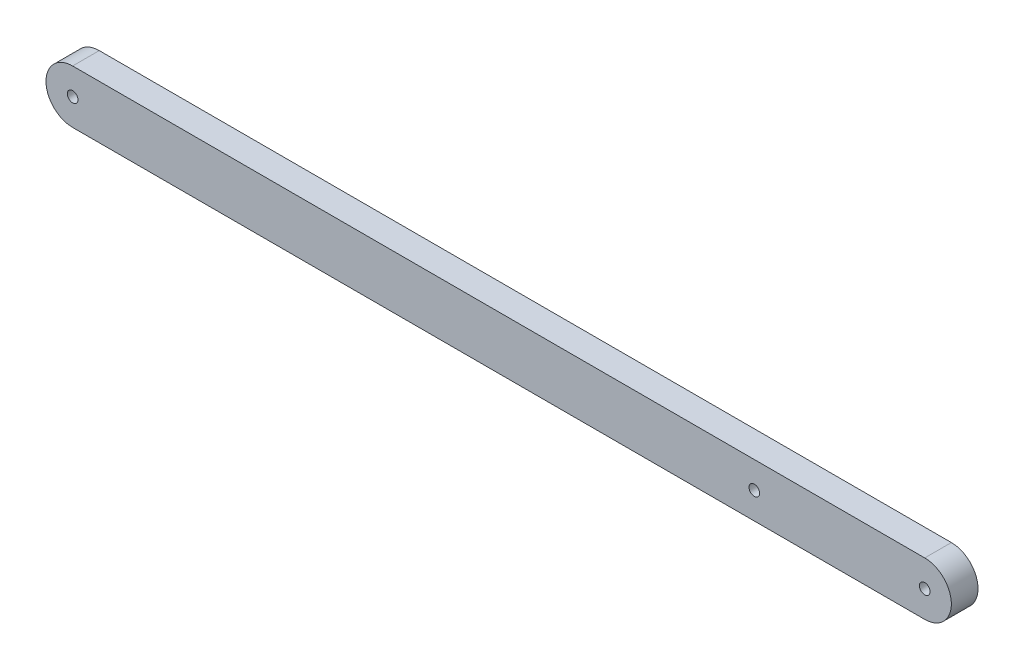
ISO-10303-21;
HEADER;
FILE_DESCRIPTION(('STEP AP214'),'2;1');
FILE_NAME('part.step','',(''),(''),'','','');
FILE_SCHEMA(('AUTOMOTIVE_DESIGN { 1 0 10303 214 1 1 1 1 }'));
ENDSEC;
DATA;
#1=APPLICATION_CONTEXT('core data for automotive mechanical design processes');
#2=APPLICATION_PROTOCOL_DEFINITION('international standard','automotive_design',2000,#1);
#3=PRODUCT_CONTEXT('',#1,'mechanical');
#4=PRODUCT('Part','Part','',(#3));
#5=PRODUCT_RELATED_PRODUCT_CATEGORY('part','',(#4));
#6=PRODUCT_DEFINITION_FORMATION('','',#4);
#7=PRODUCT_DEFINITION_CONTEXT('part definition',#1,'design');
#8=PRODUCT_DEFINITION('design','',#6,#7);
#9=PRODUCT_DEFINITION_SHAPE('','',#8);
#10=(LENGTH_UNIT() NAMED_UNIT(*) SI_UNIT(.MILLI.,.METRE.));
#11=(NAMED_UNIT(*) PLANE_ANGLE_UNIT() SI_UNIT($,.RADIAN.));
#12=(NAMED_UNIT(*) SI_UNIT($,.STERADIAN.) SOLID_ANGLE_UNIT());
#13=UNCERTAINTY_MEASURE_WITH_UNIT(LENGTH_MEASURE(1.E-05),#10,'distance_accuracy_value','');
#14=(GEOMETRIC_REPRESENTATION_CONTEXT(3) GLOBAL_UNCERTAINTY_ASSIGNED_CONTEXT((#13)) GLOBAL_UNIT_ASSIGNED_CONTEXT((#10,
#11,#12)) REPRESENTATION_CONTEXT('',''));
#15=CARTESIAN_POINT('',(0.,0.,0.));
#16=DIRECTION('',(0.,0.,1.));
#17=DIRECTION('',(1.,0.,0.));
#18=AXIS2_PLACEMENT_3D('',#15,#16,#17);
#19=CARTESIAN_POINT('',(126.76716917923,7.50418760469013,10.));
#20=DIRECTION('',(0.,0.,1.));
#21=DIRECTION('',(1.,0.,0.));
#22=AXIS2_PLACEMENT_3D('',#19,#20,#21);
#23=PLANE('',#22);
#24=CARTESIAN_POINT('',(126.76716917923,7.50418760469013,10.));
#25=DIRECTION('',(0.,0.,1.));
#26=DIRECTION('',(1.,0.,0.));
#27=AXIS2_PLACEMENT_3D('',#24,#25,#26);
#28=CIRCLE('',#27,2.);
#29=CARTESIAN_POINT('',(128.76716917923,7.50418760469013,10.));
#30=VERTEX_POINT('',#29);
#31=EDGE_CURVE('E132',#30,#30,#28,.T.);
#32=ORIENTED_EDGE('',*,*,#31,.F.);
#33=EDGE_LOOP('',(#32));
#34=FACE_BOUND('',#33,.T.);
#35=CARTESIAN_POINT('',(126.76716917923,7.50418760469013,10.));
#36=DIRECTION('',(0.,0.,1.));
#37=DIRECTION('',(1.,0.,0.));
#38=AXIS2_PLACEMENT_3D('',#35,#36,#37);
#39=CIRCLE('',#38,10.);
#40=CARTESIAN_POINT('',(126.76716917923,-2.49581239530987,10.));
#41=VERTEX_POINT('',#40);
#42=CARTESIAN_POINT('',(126.76716917923,17.5041876046901,10.));
#43=VERTEX_POINT('',#42);
#44=EDGE_CURVE('E90',#41,#43,#39,.T.);
#45=ORIENTED_EDGE('',*,*,#44,.T.);
#46=DIRECTION('',(-1.,0.,0.));
#47=VECTOR('',#46,1.);
#48=CARTESIAN_POINT('',(126.76716917923,17.5041876046901,10.));
#49=LINE('',#48,#47);
#50=CARTESIAN_POINT('',(-193.23283082077,17.5041876046901,10.));
#51=VERTEX_POINT('',#50);
#52=EDGE_CURVE('E85',#43,#51,#49,.T.);
#53=ORIENTED_EDGE('',*,*,#52,.T.);
#54=CARTESIAN_POINT('',(-193.23283082077,7.50418760469013,10.));
#55=DIRECTION('',(0.,0.,1.));
#56=DIRECTION('',(1.,0.,0.));
#57=AXIS2_PLACEMENT_3D('',#54,#55,#56);
#58=CIRCLE('',#57,10.);
#59=CARTESIAN_POINT('',(-193.23283082077,-2.49581239530991,10.));
#60=VERTEX_POINT('',#59);
#61=EDGE_CURVE('E88',#51,#60,#58,.T.);
#62=ORIENTED_EDGE('',*,*,#61,.T.);
#63=DIRECTION('',(1.,0.,0.));
#64=VECTOR('',#63,1.);
#65=CARTESIAN_POINT('',(126.76716917923,-2.49581239530987,10.));
#66=LINE('',#65,#64);
#67=EDGE_CURVE('E55',#60,#41,#66,.T.);
#68=ORIENTED_EDGE('',*,*,#67,.T.);
#69=EDGE_LOOP('',(#45,#53,#62,#68));
#70=FACE_BOUND('',#69,.T.);
#71=CARTESIAN_POINT('',(-193.23283082077,7.50418760469013,10.));
#72=DIRECTION('',(0.,0.,1.));
#73=DIRECTION('',(1.,0.,0.));
#74=AXIS2_PLACEMENT_3D('',#71,#72,#73);
#75=CIRCLE('',#74,2.);
#76=CARTESIAN_POINT('',(-191.23283082077,7.50418760469013,10.));
#77=VERTEX_POINT('',#76);
#78=EDGE_CURVE('E112',#77,#77,#75,.T.);
#79=ORIENTED_EDGE('',*,*,#78,.F.);
#80=EDGE_LOOP('',(#79));
#81=FACE_BOUND('',#80,.T.);
#82=CARTESIAN_POINT('',(62.7671691792295,7.50418760469012,10.));
#83=DIRECTION('',(0.,0.,1.));
#84=DIRECTION('',(1.,0.,0.));
#85=AXIS2_PLACEMENT_3D('',#82,#83,#84);
#86=CIRCLE('',#85,2.);
#87=CARTESIAN_POINT('',(64.7671691792295,7.50418760469012,10.));
#88=VERTEX_POINT('',#87);
#89=EDGE_CURVE('E140',#88,#88,#86,.T.);
#90=ORIENTED_EDGE('',*,*,#89,.F.);
#91=EDGE_LOOP('',(#90));
#92=FACE_BOUND('',#91,.T.);
#93=ADVANCED_FACE('F37',(#34,#70,#81,#92),#23,.T.);
#94=CARTESIAN_POINT('',(126.76716917923,7.50418760469013,0.));
#95=DIRECTION('',(0.,0.,1.));
#96=DIRECTION('',(1.,0.,0.));
#97=AXIS2_PLACEMENT_3D('',#94,#95,#96);
#98=PLANE('',#97);
#99=CARTESIAN_POINT('',(126.76716917923,7.50418760469013,0.));
#100=DIRECTION('',(0.,0.,1.));
#101=DIRECTION('',(1.,0.,0.));
#102=AXIS2_PLACEMENT_3D('',#99,#100,#101);
#103=CIRCLE('',#102,10.);
#104=CARTESIAN_POINT('',(126.76716917923,-2.49581239530987,0.));
#105=VERTEX_POINT('',#104);
#106=CARTESIAN_POINT('',(126.76716917923,17.5041876046901,0.));
#107=VERTEX_POINT('',#106);
#108=EDGE_CURVE('E108',#105,#107,#103,.T.);
#109=ORIENTED_EDGE('',*,*,#108,.F.);
#110=DIRECTION('',(1.,0.,0.));
#111=VECTOR('',#110,1.);
#112=CARTESIAN_POINT('',(126.76716917923,-2.49581239530987,0.));
#113=LINE('',#112,#111);
#114=CARTESIAN_POINT('',(-193.23283082077,-2.49581239530991,0.));
#115=VERTEX_POINT('',#114);
#116=EDGE_CURVE('E78',#115,#105,#113,.T.);
#117=ORIENTED_EDGE('',*,*,#116,.F.);
#118=CARTESIAN_POINT('',(-193.23283082077,7.50418760469013,0.));
#119=DIRECTION('',(0.,0.,1.));
#120=DIRECTION('',(1.,0.,0.));
#121=AXIS2_PLACEMENT_3D('',#118,#119,#120);
#122=CIRCLE('',#121,10.);
#123=CARTESIAN_POINT('',(-193.23283082077,17.5041876046901,0.));
#124=VERTEX_POINT('',#123);
#125=EDGE_CURVE('E72',#124,#115,#122,.T.);
#126=ORIENTED_EDGE('',*,*,#125,.F.);
#127=DIRECTION('',(-1.,0.,0.));
#128=VECTOR('',#127,1.);
#129=CARTESIAN_POINT('',(126.76716917923,17.5041876046901,0.));
#130=LINE('',#129,#128);
#131=EDGE_CURVE('E95',#107,#124,#130,.T.);
#132=ORIENTED_EDGE('',*,*,#131,.F.);
#133=EDGE_LOOP('',(#109,#117,#126,#132));
#134=FACE_BOUND('',#133,.T.);
#135=CARTESIAN_POINT('',(-193.23283082077,7.50418760469013,0.));
#136=DIRECTION('',(0.,0.,1.));
#137=DIRECTION('',(1.,0.,0.));
#138=AXIS2_PLACEMENT_3D('',#135,#136,#137);
#139=CIRCLE('',#138,2.);
#140=CARTESIAN_POINT('',(-191.23283082077,7.50418760469013,0.));
#141=VERTEX_POINT('',#140);
#142=EDGE_CURVE('E128',#141,#141,#139,.T.);
#143=ORIENTED_EDGE('',*,*,#142,.T.);
#144=EDGE_LOOP('',(#143));
#145=FACE_BOUND('',#144,.T.);
#146=CARTESIAN_POINT('',(126.76716917923,7.50418760469013,0.));
#147=DIRECTION('',(0.,0.,1.));
#148=DIRECTION('',(1.,0.,0.));
#149=AXIS2_PLACEMENT_3D('',#146,#147,#148);
#150=CIRCLE('',#149,2.);
#151=CARTESIAN_POINT('',(128.76716917923,7.50418760469013,0.));
#152=VERTEX_POINT('',#151);
#153=EDGE_CURVE('E136',#152,#152,#150,.T.);
#154=ORIENTED_EDGE('',*,*,#153,.T.);
#155=EDGE_LOOP('',(#154));
#156=FACE_BOUND('',#155,.T.);
#157=CARTESIAN_POINT('',(62.7671691792295,7.50418760469012,0.));
#158=DIRECTION('',(0.,0.,1.));
#159=DIRECTION('',(1.,0.,0.));
#160=AXIS2_PLACEMENT_3D('',#157,#158,#159);
#161=CIRCLE('',#160,2.);
#162=CARTESIAN_POINT('',(64.7671691792295,7.50418760469012,0.));
#163=VERTEX_POINT('',#162);
#164=EDGE_CURVE('E144',#163,#163,#161,.T.);
#165=ORIENTED_EDGE('',*,*,#164,.T.);
#166=EDGE_LOOP('',(#165));
#167=FACE_BOUND('',#166,.T.);
#168=ADVANCED_FACE('F123',(#134,#145,#156,#167),#98,.F.);
#169=CARTESIAN_POINT('',(126.76716917923,7.50418760469013,10.));
#170=DIRECTION('',(0.,0.,-1.));
#171=DIRECTION('',(-1.,0.,0.));
#172=AXIS2_PLACEMENT_3D('',#169,#170,#171);
#173=CYLINDRICAL_SURFACE('',#172,10.);
#174=ORIENTED_EDGE('',*,*,#108,.T.);
#175=DIRECTION('',(0.,0.,-1.));
#176=VECTOR('',#175,1.);
#177=CARTESIAN_POINT('',(126.76716917923,17.5041876046901,10.));
#178=LINE('',#177,#176);
#179=EDGE_CURVE('E11',#43,#107,#178,.T.);
#180=ORIENTED_EDGE('',*,*,#179,.F.);
#181=ORIENTED_EDGE('',*,*,#44,.F.);
#182=DIRECTION('',(0.,0.,-1.));
#183=VECTOR('',#182,1.);
#184=CARTESIAN_POINT('',(126.76716917923,-2.49581239530987,10.));
#185=LINE('',#184,#183);
#186=EDGE_CURVE('E104',#41,#105,#185,.T.);
#187=ORIENTED_EDGE('',*,*,#186,.T.);
#188=EDGE_LOOP('',(#174,#180,#181,#187));
#189=FACE_BOUND('',#188,.T.);
#190=ADVANCED_FACE('F39',(#189),#173,.T.);
#191=CARTESIAN_POINT('',(126.76716917923,17.5041876046901,10.));
#192=DIRECTION('',(0.,-1.,0.));
#193=DIRECTION('',(1.,0.,0.));
#194=AXIS2_PLACEMENT_3D('',#191,#192,#193);
#195=PLANE('',#194);
#196=ORIENTED_EDGE('',*,*,#131,.T.);
#197=DIRECTION('',(0.,0.,-1.));
#198=VECTOR('',#197,1.);
#199=CARTESIAN_POINT('',(-193.23283082077,17.5041876046901,10.));
#200=LINE('',#199,#198);
#201=EDGE_CURVE('E47',#51,#124,#200,.T.);
#202=ORIENTED_EDGE('',*,*,#201,.F.);
#203=ORIENTED_EDGE('',*,*,#52,.F.);
#204=ORIENTED_EDGE('',*,*,#179,.T.);
#205=EDGE_LOOP('',(#196,#202,#203,#204));
#206=FACE_BOUND('',#205,.T.);
#207=ADVANCED_FACE('F94',(#206),#195,.F.);
#208=CARTESIAN_POINT('',(-193.23283082077,7.50418760469013,10.));
#209=DIRECTION('',(0.,0.,-1.));
#210=DIRECTION('',(-1.,0.,0.));
#211=AXIS2_PLACEMENT_3D('',#208,#209,#210);
#212=CYLINDRICAL_SURFACE('',#211,10.);
#213=ORIENTED_EDGE('',*,*,#125,.T.);
#214=DIRECTION('',(0.,0.,-1.));
#215=VECTOR('',#214,1.);
#216=CARTESIAN_POINT('',(-193.23283082077,-2.49581239530991,10.));
#217=LINE('',#216,#215);
#218=EDGE_CURVE('E97',#60,#115,#217,.T.);
#219=ORIENTED_EDGE('',*,*,#218,.F.);
#220=ORIENTED_EDGE('',*,*,#61,.F.);
#221=ORIENTED_EDGE('',*,*,#201,.T.);
#222=EDGE_LOOP('',(#213,#219,#220,#221));
#223=FACE_BOUND('',#222,.T.);
#224=ADVANCED_FACE('F98',(#223),#212,.T.);
#225=CARTESIAN_POINT('',(126.76716917923,-2.49581239530987,10.));
#226=DIRECTION('',(0.,1.,0.));
#227=DIRECTION('',(-1.,0.,0.));
#228=AXIS2_PLACEMENT_3D('',#225,#226,#227);
#229=PLANE('',#228);
#230=ORIENTED_EDGE('',*,*,#116,.T.);
#231=ORIENTED_EDGE('',*,*,#186,.F.);
#232=ORIENTED_EDGE('',*,*,#67,.F.);
#233=ORIENTED_EDGE('',*,*,#218,.T.);
#234=EDGE_LOOP('',(#230,#231,#232,#233));
#235=FACE_BOUND('',#234,.T.);
#236=ADVANCED_FACE('F120',(#235),#229,.F.);
#237=CARTESIAN_POINT('',(-193.23283082077,7.50418760469013,10.));
#238=DIRECTION('',(0.,0.,-1.));
#239=DIRECTION('',(-1.,0.,0.));
#240=AXIS2_PLACEMENT_3D('',#237,#238,#239);
#241=CYLINDRICAL_SURFACE('',#240,2.);
#242=ORIENTED_EDGE('',*,*,#78,.T.);
#243=EDGE_LOOP('',(#242));
#244=FACE_BOUND('',#243,.T.);
#245=ORIENTED_EDGE('',*,*,#142,.F.);
#246=EDGE_LOOP('',(#245));
#247=FACE_BOUND('',#246,.T.);
#248=ADVANCED_FACE('F164',(#244,#247),#241,.F.);
#249=CARTESIAN_POINT('',(126.76716917923,7.50418760469013,10.));
#250=DIRECTION('',(0.,0.,-1.));
#251=DIRECTION('',(-1.,0.,0.));
#252=AXIS2_PLACEMENT_3D('',#249,#250,#251);
#253=CYLINDRICAL_SURFACE('',#252,2.);
#254=ORIENTED_EDGE('',*,*,#31,.T.);
#255=EDGE_LOOP('',(#254));
#256=FACE_BOUND('',#255,.T.);
#257=ORIENTED_EDGE('',*,*,#153,.F.);
#258=EDGE_LOOP('',(#257));
#259=FACE_BOUND('',#258,.T.);
#260=ADVANCED_FACE('F216',(#256,#259),#253,.F.);
#261=CARTESIAN_POINT('',(62.7671691792295,7.50418760469012,10.));
#262=DIRECTION('',(0.,0.,-1.));
#263=DIRECTION('',(-1.,0.,0.));
#264=AXIS2_PLACEMENT_3D('',#261,#262,#263);
#265=CYLINDRICAL_SURFACE('',#264,2.);
#266=ORIENTED_EDGE('',*,*,#89,.T.);
#267=EDGE_LOOP('',(#266));
#268=FACE_BOUND('',#267,.T.);
#269=ORIENTED_EDGE('',*,*,#164,.F.);
#270=EDGE_LOOP('',(#269));
#271=FACE_BOUND('',#270,.T.);
#272=ADVANCED_FACE('F152',(#268,#271),#265,.F.);
#273=CLOSED_SHELL('',(#93,#168,#190,#207,#224,#236,#248,#260,#272));
#274=MANIFOLD_SOLID_BREP('B2',#273);
#275=ADVANCED_BREP_SHAPE_REPRESENTATION('',(#18,#274),#14);
#276=SHAPE_DEFINITION_REPRESENTATION(#9,#275);
ENDSEC;
END-ISO-10303-21;
